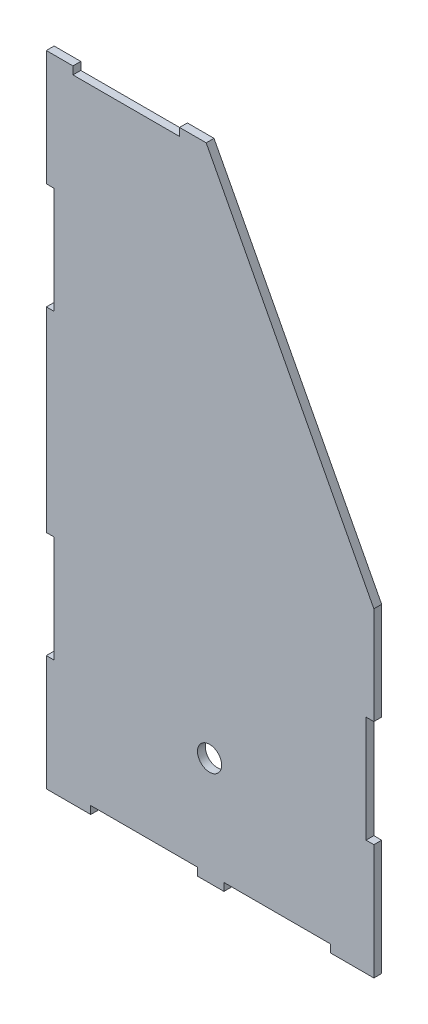
ISO-10303-21;
HEADER;
FILE_DESCRIPTION(('STEP AP214'),'2;1');
FILE_NAME('part.step','',(''),(''),'','','');
FILE_SCHEMA(('AUTOMOTIVE_DESIGN { 1 0 10303 214 1 1 1 1 }'));
ENDSEC;
DATA;
#1=APPLICATION_CONTEXT('core data for automotive mechanical design processes');
#2=APPLICATION_PROTOCOL_DEFINITION('international standard','automotive_design',2000,#1);
#3=PRODUCT_CONTEXT('',#1,'mechanical');
#4=PRODUCT('Part','Part','',(#3));
#5=PRODUCT_RELATED_PRODUCT_CATEGORY('part','',(#4));
#6=PRODUCT_DEFINITION_FORMATION('','',#4);
#7=PRODUCT_DEFINITION_CONTEXT('part definition',#1,'design');
#8=PRODUCT_DEFINITION('design','',#6,#7);
#9=PRODUCT_DEFINITION_SHAPE('','',#8);
#10=(LENGTH_UNIT() NAMED_UNIT(*) SI_UNIT(.MILLI.,.METRE.));
#11=(NAMED_UNIT(*) PLANE_ANGLE_UNIT() SI_UNIT($,.RADIAN.));
#12=(NAMED_UNIT(*) SI_UNIT($,.STERADIAN.) SOLID_ANGLE_UNIT());
#13=UNCERTAINTY_MEASURE_WITH_UNIT(LENGTH_MEASURE(1.E-05),#10,'distance_accuracy_value','');
#14=(GEOMETRIC_REPRESENTATION_CONTEXT(3) GLOBAL_UNCERTAINTY_ASSIGNED_CONTEXT((#13)) GLOBAL_UNIT_ASSIGNED_CONTEXT((#10,
#11,#12)) REPRESENTATION_CONTEXT('',''));
#15=CARTESIAN_POINT('',(0.,0.,0.));
#16=DIRECTION('',(0.,0.,1.));
#17=DIRECTION('',(1.,0.,0.));
#18=AXIS2_PLACEMENT_3D('',#15,#16,#17);
#19=CARTESIAN_POINT('',(321.219883672572,642.86985555023,5.588));
#20=DIRECTION('',(1.,0.,0.));
#21=DIRECTION('',(0.,0.,-1.));
#22=AXIS2_PLACEMENT_3D('',#19,#20,#21);
#23=PLANE('',#22);
#24=DIRECTION('',(0.,-1.,0.));
#25=VECTOR('',#24,1.);
#26=CARTESIAN_POINT('',(321.219883672572,642.86985555023,0.));
#27=LINE('',#26,#25);
#28=CARTESIAN_POINT('',(321.219883672572,484.11985555023,0.));
#29=VERTEX_POINT('',#28);
#30=CARTESIAN_POINT('',(321.219883672572,344.41985555023,0.));
#31=VERTEX_POINT('',#30);
#32=EDGE_CURVE('E248',#29,#31,#27,.T.);
#33=ORIENTED_EDGE('',*,*,#32,.T.);
#34=DIRECTION('',(0.,0.,1.));
#35=VECTOR('',#34,1.);
#36=CARTESIAN_POINT('',(321.219883672572,344.41985555023,0.));
#37=LINE('',#36,#35);
#38=CARTESIAN_POINT('',(321.219883672572,344.41985555023,5.588));
#39=VERTEX_POINT('',#38);
#40=EDGE_CURVE('E377',#31,#39,#37,.T.);
#41=ORIENTED_EDGE('',*,*,#40,.T.);
#42=DIRECTION('',(0.,-1.,0.));
#43=VECTOR('',#42,1.);
#44=CARTESIAN_POINT('',(321.219883672572,642.86985555023,5.588));
#45=LINE('',#44,#43);
#46=CARTESIAN_POINT('',(321.219883672572,484.11985555023,5.588));
#47=VERTEX_POINT('',#46);
#48=EDGE_CURVE('E413',#47,#39,#45,.T.);
#49=ORIENTED_EDGE('',*,*,#48,.F.);
#50=DIRECTION('',(0.,0.,1.));
#51=VECTOR('',#50,1.);
#52=CARTESIAN_POINT('',(321.219883672572,484.11985555023,0.));
#53=LINE('',#52,#51);
#54=EDGE_CURVE('E372',#29,#47,#53,.T.);
#55=ORIENTED_EDGE('',*,*,#54,.F.);
#56=EDGE_LOOP('',(#33,#41,#49,#55));
#57=FACE_BOUND('',#56,.T.);
#58=ADVANCED_FACE('F33',(#57),#23,.F.);
#59=CARTESIAN_POINT('',(321.219883672572,642.86985555023,0.));
#60=VERTEX_POINT('',#59);
#61=CARTESIAN_POINT('',(321.219883672572,560.31985555023,0.));
#62=VERTEX_POINT('',#61);
#63=EDGE_CURVE('E251',#60,#62,#27,.T.);
#64=ORIENTED_EDGE('',*,*,#63,.T.);
#65=DIRECTION('',(0.,0.,1.));
#66=VECTOR('',#65,1.);
#67=CARTESIAN_POINT('',(321.219883672572,560.31985555023,0.));
#68=LINE('',#67,#66);
#69=CARTESIAN_POINT('',(321.219883672572,560.31985555023,5.588));
#70=VERTEX_POINT('',#69);
#71=EDGE_CURVE('E348',#62,#70,#68,.T.);
#72=ORIENTED_EDGE('',*,*,#71,.T.);
#73=CARTESIAN_POINT('',(321.219883672572,642.86985555023,5.588));
#74=VERTEX_POINT('',#73);
#75=EDGE_CURVE('E409',#74,#70,#45,.T.);
#76=ORIENTED_EDGE('',*,*,#75,.F.);
#77=DIRECTION('',(0.,0.,-1.));
#78=VECTOR('',#77,1.);
#79=CARTESIAN_POINT('',(321.219883672572,642.86985555023,5.588));
#80=LINE('',#79,#78);
#81=EDGE_CURVE('E287',#74,#60,#80,.T.);
#82=ORIENTED_EDGE('',*,*,#81,.T.);
#83=EDGE_LOOP('',(#64,#72,#76,#82));
#84=FACE_BOUND('',#83,.T.);
#85=ADVANCED_FACE('F438',(#84),#23,.F.);
#86=CARTESIAN_POINT('',(321.219883672572,185.66985555023,5.588));
#87=DIRECTION('',(0.,1.,0.));
#88=DIRECTION('',(-1.,0.,0.));
#89=AXIS2_PLACEMENT_3D('',#86,#87,#88);
#90=PLANE('',#89);
#91=DIRECTION('',(1.,0.,0.));
#92=VECTOR('',#91,1.);
#93=CARTESIAN_POINT('',(321.219883672572,185.66985555023,0.));
#94=LINE('',#93,#92);
#95=CARTESIAN_POINT('',(321.219883672572,185.66985555023,0.));
#96=VERTEX_POINT('',#95);
#97=CARTESIAN_POINT('',(352.969883672572,185.66985555023,0.));
#98=VERTEX_POINT('',#97);
#99=EDGE_CURVE('E247',#96,#98,#94,.T.);
#100=ORIENTED_EDGE('',*,*,#99,.T.);
#101=DIRECTION('',(0.,0.,1.));
#102=VECTOR('',#101,1.);
#103=CARTESIAN_POINT('',(352.969883672572,185.66985555023,0.));
#104=LINE('',#103,#102);
#105=CARTESIAN_POINT('',(352.969883672572,185.66985555023,5.588));
#106=VERTEX_POINT('',#105);
#107=EDGE_CURVE('E461',#98,#106,#104,.T.);
#108=ORIENTED_EDGE('',*,*,#107,.T.);
#109=DIRECTION('',(1.,0.,0.));
#110=VECTOR('',#109,1.);
#111=CARTESIAN_POINT('',(321.219883672572,185.66985555023,5.588));
#112=LINE('',#111,#110);
#113=CARTESIAN_POINT('',(321.219883672572,185.66985555023,5.588));
#114=VERTEX_POINT('',#113);
#115=EDGE_CURVE('E414',#114,#106,#112,.T.);
#116=ORIENTED_EDGE('',*,*,#115,.F.);
#117=DIRECTION('',(0.,0.,-1.));
#118=VECTOR('',#117,1.);
#119=CARTESIAN_POINT('',(321.219883672572,185.66985555023,5.588));
#120=LINE('',#119,#118);
#121=EDGE_CURVE('E11',#114,#96,#120,.T.);
#122=ORIENTED_EDGE('',*,*,#121,.T.);
#123=EDGE_LOOP('',(#100,#108,#116,#122));
#124=FACE_BOUND('',#123,.T.);
#125=ADVANCED_FACE('F460',(#124),#90,.F.);
#126=CARTESIAN_POINT('',(429.169883672572,185.66985555023,5.588));
#127=VERTEX_POINT('',#126);
#128=CARTESIAN_POINT('',(448.219883672572,185.66985555023,5.588));
#129=VERTEX_POINT('',#128);
#130=EDGE_CURVE('E418',#127,#129,#112,.T.);
#131=ORIENTED_EDGE('',*,*,#130,.F.);
#132=DIRECTION('',(0.,0.,1.));
#133=VECTOR('',#132,1.);
#134=CARTESIAN_POINT('',(429.169883672572,185.66985555023,0.));
#135=LINE('',#134,#133);
#136=CARTESIAN_POINT('',(429.169883672572,185.66985555023,0.));
#137=VERTEX_POINT('',#136);
#138=EDGE_CURVE('E464',#137,#127,#135,.T.);
#139=ORIENTED_EDGE('',*,*,#138,.F.);
#140=CARTESIAN_POINT('',(448.219883672572,185.66985555023,0.));
#141=VERTEX_POINT('',#140);
#142=EDGE_CURVE('E263',#137,#141,#94,.T.);
#143=ORIENTED_EDGE('',*,*,#142,.T.);
#144=DIRECTION('',(0.,0.,1.));
#145=VECTOR('',#144,1.);
#146=CARTESIAN_POINT('',(448.219883672572,185.66985555023,0.));
#147=LINE('',#146,#145);
#148=EDGE_CURVE('E344',#141,#129,#147,.T.);
#149=ORIENTED_EDGE('',*,*,#148,.T.);
#150=EDGE_LOOP('',(#131,#139,#143,#149));
#151=FACE_BOUND('',#150,.T.);
#152=ADVANCED_FACE('F525',(#151),#90,.F.);
#153=CARTESIAN_POINT('',(555.407883672572,414.26985555023,5.588));
#154=DIRECTION('',(-1.,0.,0.));
#155=DIRECTION('',(0.,-1.,0.));
#156=AXIS2_PLACEMENT_3D('',#153,#154,#155);
#157=PLANE('',#156);
#158=DIRECTION('',(0.,1.,0.));
#159=VECTOR('',#158,1.);
#160=CARTESIAN_POINT('',(555.407883672572,414.26985555023,5.588));
#161=LINE('',#160,#159);
#162=CARTESIAN_POINT('',(555.407883672572,344.41985555023,5.588));
#163=VERTEX_POINT('',#162);
#164=CARTESIAN_POINT('',(555.407883672572,414.26985555023,5.588));
#165=VERTEX_POINT('',#164);
#166=EDGE_CURVE('E417',#163,#165,#161,.T.);
#167=ORIENTED_EDGE('',*,*,#166,.F.);
#168=DIRECTION('',(0.,0.,1.));
#169=VECTOR('',#168,1.);
#170=CARTESIAN_POINT('',(555.407883672572,344.41985555023,0.));
#171=LINE('',#170,#169);
#172=CARTESIAN_POINT('',(555.407883672572,344.41985555023,0.));
#173=VERTEX_POINT('',#172);
#174=EDGE_CURVE('E330',#173,#163,#171,.T.);
#175=ORIENTED_EDGE('',*,*,#174,.F.);
#176=DIRECTION('',(0.,1.,0.));
#177=VECTOR('',#176,1.);
#178=CARTESIAN_POINT('',(555.407883672572,414.26985555023,0.));
#179=LINE('',#178,#177);
#180=CARTESIAN_POINT('',(555.407883672572,414.26985555023,0.));
#181=VERTEX_POINT('',#180);
#182=EDGE_CURVE('E271',#173,#181,#179,.T.);
#183=ORIENTED_EDGE('',*,*,#182,.T.);
#184=DIRECTION('',(0.,0.,-1.));
#185=VECTOR('',#184,1.);
#186=CARTESIAN_POINT('',(555.407883672572,414.26985555023,5.588));
#187=LINE('',#186,#185);
#188=EDGE_CURVE('E293',#165,#181,#187,.T.);
#189=ORIENTED_EDGE('',*,*,#188,.F.);
#190=EDGE_LOOP('',(#167,#175,#183,#189));
#191=FACE_BOUND('',#190,.T.);
#192=ADVANCED_FACE('F526',(#191),#157,.F.);
#193=CARTESIAN_POINT('',(321.219883672572,642.86985555023,5.588));
#194=DIRECTION('',(0.,-1.,0.));
#195=DIRECTION('',(0.,0.,-1.));
#196=AXIS2_PLACEMENT_3D('',#193,#194,#195);
#197=PLANE('',#196);
#198=DIRECTION('',(-1.,0.,0.));
#199=VECTOR('',#198,1.);
#200=CARTESIAN_POINT('',(321.219883672572,642.86985555023,0.));
#201=LINE('',#200,#199);
#202=CARTESIAN_POINT('',(435.519883672572,642.86985555023,0.));
#203=VERTEX_POINT('',#202);
#204=CARTESIAN_POINT('',(416.469883672572,642.86985555023,0.));
#205=VERTEX_POINT('',#204);
#206=EDGE_CURVE('E284',#203,#205,#201,.T.);
#207=ORIENTED_EDGE('',*,*,#206,.T.);
#208=DIRECTION('',(0.,0.,1.));
#209=VECTOR('',#208,1.);
#210=CARTESIAN_POINT('',(416.469883672572,642.86985555023,0.));
#211=LINE('',#210,#209);
#212=CARTESIAN_POINT('',(416.469883672572,642.86985555023,5.588));
#213=VERTEX_POINT('',#212);
#214=EDGE_CURVE('E397',#205,#213,#211,.T.);
#215=ORIENTED_EDGE('',*,*,#214,.T.);
#216=DIRECTION('',(-1.,0.,0.));
#217=VECTOR('',#216,1.);
#218=CARTESIAN_POINT('',(321.219883672572,642.86985555023,5.588));
#219=LINE('',#218,#217);
#220=CARTESIAN_POINT('',(435.519883672572,642.86985555023,5.588));
#221=VERTEX_POINT('',#220);
#222=EDGE_CURVE('E290',#221,#213,#219,.T.);
#223=ORIENTED_EDGE('',*,*,#222,.F.);
#224=DIRECTION('',(0.,0.,-1.));
#225=VECTOR('',#224,1.);
#226=CARTESIAN_POINT('',(435.519883672572,642.86985555023,5.588));
#227=LINE('',#226,#225);
#228=EDGE_CURVE('E289',#221,#203,#227,.T.);
#229=ORIENTED_EDGE('',*,*,#228,.T.);
#230=EDGE_LOOP('',(#207,#215,#223,#229));
#231=FACE_BOUND('',#230,.T.);
#232=ADVANCED_FACE('F520',(#231),#197,.F.);
#233=CARTESIAN_POINT('',(321.219883672572,268.21985555023,5.588));
#234=VERTEX_POINT('',#233);
#235=EDGE_CURVE('E240',#234,#114,#45,.T.);
#236=ORIENTED_EDGE('',*,*,#235,.F.);
#237=DIRECTION('',(0.,0.,1.));
#238=VECTOR('',#237,1.);
#239=CARTESIAN_POINT('',(321.219883672572,268.21985555023,0.));
#240=LINE('',#239,#238);
#241=CARTESIAN_POINT('',(321.219883672572,268.21985555023,0.));
#242=VERTEX_POINT('',#241);
#243=EDGE_CURVE('E228',#242,#234,#240,.T.);
#244=ORIENTED_EDGE('',*,*,#243,.F.);
#245=EDGE_CURVE('E238',#242,#96,#27,.T.);
#246=ORIENTED_EDGE('',*,*,#245,.T.);
#247=ORIENTED_EDGE('',*,*,#121,.F.);
#248=EDGE_LOOP('',(#236,#244,#246,#247));
#249=FACE_BOUND('',#248,.T.);
#250=ADVANCED_FACE('F35',(#249),#23,.F.);
#251=CARTESIAN_POINT('',(524.419883672572,185.66985555023,5.588));
#252=VERTEX_POINT('',#251);
#253=CARTESIAN_POINT('',(555.407883672572,185.66985555023,5.588));
#254=VERTEX_POINT('',#253);
#255=EDGE_CURVE('E412',#252,#254,#112,.T.);
#256=ORIENTED_EDGE('',*,*,#255,.F.);
#257=DIRECTION('',(0.,0.,1.));
#258=VECTOR('',#257,1.);
#259=CARTESIAN_POINT('',(524.419883672572,185.66985555023,0.));
#260=LINE('',#259,#258);
#261=CARTESIAN_POINT('',(524.419883672572,185.66985555023,0.));
#262=VERTEX_POINT('',#261);
#263=EDGE_CURVE('E358',#262,#252,#260,.T.);
#264=ORIENTED_EDGE('',*,*,#263,.F.);
#265=CARTESIAN_POINT('',(555.407883672572,185.66985555023,0.));
#266=VERTEX_POINT('',#265);
#267=EDGE_CURVE('E258',#262,#266,#94,.T.);
#268=ORIENTED_EDGE('',*,*,#267,.T.);
#269=DIRECTION('',(0.,0.,-1.));
#270=VECTOR('',#269,1.);
#271=CARTESIAN_POINT('',(555.407883672572,185.66985555023,5.588));
#272=LINE('',#271,#270);
#273=EDGE_CURVE('E42',#254,#266,#272,.T.);
#274=ORIENTED_EDGE('',*,*,#273,.F.);
#275=EDGE_LOOP('',(#256,#264,#268,#274));
#276=FACE_BOUND('',#275,.T.);
#277=ADVANCED_FACE('F519',(#276),#90,.F.);
#278=CARTESIAN_POINT('',(555.407883672572,268.21985555023,0.));
#279=VERTEX_POINT('',#278);
#280=EDGE_CURVE('E274',#266,#279,#179,.T.);
#281=ORIENTED_EDGE('',*,*,#280,.T.);
#282=DIRECTION('',(0.,0.,1.));
#283=VECTOR('',#282,1.);
#284=CARTESIAN_POINT('',(555.407883672572,268.21985555023,0.));
#285=LINE('',#284,#283);
#286=CARTESIAN_POINT('',(555.407883672572,268.21985555023,5.588));
#287=VERTEX_POINT('',#286);
#288=EDGE_CURVE('E332',#279,#287,#285,.T.);
#289=ORIENTED_EDGE('',*,*,#288,.T.);
#290=EDGE_CURVE('E301',#254,#287,#161,.T.);
#291=ORIENTED_EDGE('',*,*,#290,.F.);
#292=ORIENTED_EDGE('',*,*,#273,.T.);
#293=EDGE_LOOP('',(#281,#289,#291,#292));
#294=FACE_BOUND('',#293,.T.);
#295=ADVANCED_FACE('F298',(#294),#157,.F.);
#296=CARTESIAN_POINT('',(435.519883672572,642.86985555023,5.588));
#297=DIRECTION('',(-0.88560030787723,-0.464448161464502,0.));
#298=DIRECTION('',(0.464448161464502,-0.88560030787723,0.));
#299=AXIS2_PLACEMENT_3D('',#296,#297,#298);
#300=PLANE('',#299);
#301=DIRECTION('',(-0.464448161464502,0.88560030787723,0.));
#302=VECTOR('',#301,1.);
#303=CARTESIAN_POINT('',(435.519883672572,642.86985555023,0.));
#304=LINE('',#303,#302);
#305=EDGE_CURVE('E280',#181,#203,#304,.T.);
#306=ORIENTED_EDGE('',*,*,#305,.T.);
#307=ORIENTED_EDGE('',*,*,#228,.F.);
#308=DIRECTION('',(-0.464448161464502,0.88560030787723,0.));
#309=VECTOR('',#308,1.);
#310=CARTESIAN_POINT('',(435.519883672572,642.86985555023,5.588));
#311=LINE('',#310,#309);
#312=EDGE_CURVE('E420',#165,#221,#311,.T.);
#313=ORIENTED_EDGE('',*,*,#312,.F.);
#314=ORIENTED_EDGE('',*,*,#188,.T.);
#315=EDGE_LOOP('',(#306,#307,#313,#314));
#316=FACE_BOUND('',#315,.T.);
#317=ADVANCED_FACE('F536',(#316),#300,.F.);
#318=CARTESIAN_POINT('',(340.269883672572,642.86985555023,5.588));
#319=VERTEX_POINT('',#318);
#320=EDGE_CURVE('E421',#319,#74,#219,.T.);
#321=ORIENTED_EDGE('',*,*,#320,.F.);
#322=DIRECTION('',(0.,0.,1.));
#323=VECTOR('',#322,1.);
#324=CARTESIAN_POINT('',(340.269883672572,642.86985555023,0.));
#325=LINE('',#324,#323);
#326=CARTESIAN_POINT('',(340.269883672572,642.86985555023,0.));
#327=VERTEX_POINT('',#326);
#328=EDGE_CURVE('E405',#327,#319,#325,.T.);
#329=ORIENTED_EDGE('',*,*,#328,.F.);
#330=EDGE_CURVE('E283',#327,#60,#201,.T.);
#331=ORIENTED_EDGE('',*,*,#330,.T.);
#332=ORIENTED_EDGE('',*,*,#81,.F.);
#333=EDGE_LOOP('',(#321,#329,#331,#332));
#334=FACE_BOUND('',#333,.T.);
#335=ADVANCED_FACE('F436',(#334),#197,.F.);
#336=CARTESIAN_POINT('',(0.,0.,5.588));
#337=DIRECTION('',(0.,0.,1.));
#338=DIRECTION('',(1.,0.,0.));
#339=AXIS2_PLACEMENT_3D('',#336,#337,#338);
#340=PLANE('',#339);
#341=CARTESIAN_POINT('',(437.932883672572,262.989065336249,5.588));
#342=DIRECTION('',(0.,0.,1.));
#343=DIRECTION('',(1.,0.,0.));
#344=AXIS2_PLACEMENT_3D('',#341,#342,#343);
#345=CIRCLE('',#344,8.63599999999998);
#346=CARTESIAN_POINT('',(446.568883672572,262.989065336249,5.588));
#347=VERTEX_POINT('',#346);
#348=EDGE_CURVE('E496',#347,#347,#345,.T.);
#349=ORIENTED_EDGE('',*,*,#348,.F.);
#350=EDGE_LOOP('',(#349));
#351=FACE_BOUND('',#350,.T.);
#352=DIRECTION('',(-1.,0.,0.));
#353=VECTOR('',#352,1.);
#354=CARTESIAN_POINT('',(549.819883672572,344.41985555023,5.588));
#355=LINE('',#354,#353);
#356=CARTESIAN_POINT('',(549.819883672572,344.41985555023,5.588));
#357=VERTEX_POINT('',#356);
#358=EDGE_CURVE('E316',#163,#357,#355,.T.);
#359=ORIENTED_EDGE('',*,*,#358,.F.);
#360=ORIENTED_EDGE('',*,*,#166,.T.);
#361=ORIENTED_EDGE('',*,*,#312,.T.);
#362=ORIENTED_EDGE('',*,*,#222,.T.);
#363=DIRECTION('',(0.,1.,0.));
#364=VECTOR('',#363,1.);
#365=CARTESIAN_POINT('',(416.469883672572,642.86985555023,5.588));
#366=LINE('',#365,#364);
#367=CARTESIAN_POINT('',(416.469883672572,637.28185555023,5.588));
#368=VERTEX_POINT('',#367);
#369=EDGE_CURVE('E355',#368,#213,#366,.T.);
#370=ORIENTED_EDGE('',*,*,#369,.F.);
#371=DIRECTION('',(1.,0.,0.));
#372=VECTOR('',#371,1.);
#373=CARTESIAN_POINT('',(416.469883672572,637.28185555023,5.588));
#374=LINE('',#373,#372);
#375=CARTESIAN_POINT('',(340.269883672572,637.28185555023,5.588));
#376=VERTEX_POINT('',#375);
#377=EDGE_CURVE('E391',#376,#368,#374,.T.);
#378=ORIENTED_EDGE('',*,*,#377,.F.);
#379=DIRECTION('',(0.,-1.,0.));
#380=VECTOR('',#379,1.);
#381=CARTESIAN_POINT('',(340.269883672572,642.86985555023,5.588));
#382=LINE('',#381,#380);
#383=EDGE_CURVE('E399',#319,#376,#382,.T.);
#384=ORIENTED_EDGE('',*,*,#383,.F.);
#385=ORIENTED_EDGE('',*,*,#320,.T.);
#386=ORIENTED_EDGE('',*,*,#75,.T.);
#387=DIRECTION('',(-1.,0.,0.));
#388=VECTOR('',#387,1.);
#389=CARTESIAN_POINT('',(321.219883672572,560.31985555023,5.588));
#390=LINE('',#389,#388);
#391=CARTESIAN_POINT('',(326.807883672572,560.31985555023,5.588));
#392=VERTEX_POINT('',#391);
#393=EDGE_CURVE('E366',#392,#70,#390,.T.);
#394=ORIENTED_EDGE('',*,*,#393,.F.);
#395=DIRECTION('',(0.,1.,0.));
#396=VECTOR('',#395,1.);
#397=CARTESIAN_POINT('',(326.807883672572,560.31985555023,5.588));
#398=LINE('',#397,#396);
#399=CARTESIAN_POINT('',(326.807883672572,484.11985555023,5.588));
#400=VERTEX_POINT('',#399);
#401=EDGE_CURVE('E376',#400,#392,#398,.T.);
#402=ORIENTED_EDGE('',*,*,#401,.F.);
#403=DIRECTION('',(1.,0.,0.));
#404=VECTOR('',#403,1.);
#405=CARTESIAN_POINT('',(321.219883672572,484.11985555023,5.588));
#406=LINE('',#405,#404);
#407=EDGE_CURVE('E373',#47,#400,#406,.T.);
#408=ORIENTED_EDGE('',*,*,#407,.F.);
#409=ORIENTED_EDGE('',*,*,#48,.T.);
#410=DIRECTION('',(-1.,0.,0.));
#411=VECTOR('',#410,1.);
#412=CARTESIAN_POINT('',(321.219883672572,344.41985555023,5.588));
#413=LINE('',#412,#411);
#414=CARTESIAN_POINT('',(326.807883672572,344.41985555023,5.588));
#415=VERTEX_POINT('',#414);
#416=EDGE_CURVE('E233',#415,#39,#413,.T.);
#417=ORIENTED_EDGE('',*,*,#416,.F.);
#418=DIRECTION('',(0.,1.,0.));
#419=VECTOR('',#418,1.);
#420=CARTESIAN_POINT('',(326.807883672572,344.41985555023,5.588));
#421=LINE('',#420,#419);
#422=CARTESIAN_POINT('',(326.807883672572,268.21985555023,5.588));
#423=VERTEX_POINT('',#422);
#424=EDGE_CURVE('E489',#423,#415,#421,.T.);
#425=ORIENTED_EDGE('',*,*,#424,.F.);
#426=DIRECTION('',(1.,0.,0.));
#427=VECTOR('',#426,1.);
#428=CARTESIAN_POINT('',(321.219883672572,268.21985555023,5.588));
#429=LINE('',#428,#427);
#430=EDGE_CURVE('E459',#234,#423,#429,.T.);
#431=ORIENTED_EDGE('',*,*,#430,.F.);
#432=ORIENTED_EDGE('',*,*,#235,.T.);
#433=ORIENTED_EDGE('',*,*,#115,.T.);
#434=DIRECTION('',(0.,-1.,0.));
#435=VECTOR('',#434,1.);
#436=CARTESIAN_POINT('',(352.969883672572,191.25785555023,5.588));
#437=LINE('',#436,#435);
#438=CARTESIAN_POINT('',(352.969883672572,191.25785555023,5.588));
#439=VERTEX_POINT('',#438);
#440=EDGE_CURVE('E329',#439,#106,#437,.T.);
#441=ORIENTED_EDGE('',*,*,#440,.F.);
#442=DIRECTION('',(-1.,0.,0.));
#443=VECTOR('',#442,1.);
#444=CARTESIAN_POINT('',(352.969883672572,191.25785555023,5.588));
#445=LINE('',#444,#443);
#446=CARTESIAN_POINT('',(429.169883672572,191.25785555023,5.588));
#447=VERTEX_POINT('',#446);
#448=EDGE_CURVE('E473',#447,#439,#445,.T.);
#449=ORIENTED_EDGE('',*,*,#448,.F.);
#450=DIRECTION('',(0.,1.,0.));
#451=VECTOR('',#450,1.);
#452=CARTESIAN_POINT('',(429.169883672572,191.25785555023,5.588));
#453=LINE('',#452,#451);
#454=EDGE_CURVE('E477',#127,#447,#453,.T.);
#455=ORIENTED_EDGE('',*,*,#454,.F.);
#456=ORIENTED_EDGE('',*,*,#130,.T.);
#457=DIRECTION('',(0.,-1.,0.));
#458=VECTOR('',#457,1.);
#459=CARTESIAN_POINT('',(448.219883672572,191.25785555023,5.588));
#460=LINE('',#459,#458);
#461=CARTESIAN_POINT('',(448.219883672572,191.25785555023,5.588));
#462=VERTEX_POINT('',#461);
#463=EDGE_CURVE('E345',#462,#129,#460,.T.);
#464=ORIENTED_EDGE('',*,*,#463,.F.);
#465=DIRECTION('',(-1.,0.,0.));
#466=VECTOR('',#465,1.);
#467=CARTESIAN_POINT('',(448.219883672572,191.25785555023,5.588));
#468=LINE('',#467,#466);
#469=CARTESIAN_POINT('',(524.419883672572,191.25785555023,5.588));
#470=VERTEX_POINT('',#469);
#471=EDGE_CURVE('E339',#470,#462,#468,.T.);
#472=ORIENTED_EDGE('',*,*,#471,.F.);
#473=DIRECTION('',(0.,1.,0.));
#474=VECTOR('',#473,1.);
#475=CARTESIAN_POINT('',(524.419883672572,191.25785555023,5.588));
#476=LINE('',#475,#474);
#477=EDGE_CURVE('E347',#252,#470,#476,.T.);
#478=ORIENTED_EDGE('',*,*,#477,.F.);
#479=ORIENTED_EDGE('',*,*,#255,.T.);
#480=ORIENTED_EDGE('',*,*,#290,.T.);
#481=DIRECTION('',(1.,0.,0.));
#482=VECTOR('',#481,1.);
#483=CARTESIAN_POINT('',(549.819883672572,268.21985555023,5.588));
#484=LINE('',#483,#482);
#485=CARTESIAN_POINT('',(549.819883672572,268.21985555023,5.588));
#486=VERTEX_POINT('',#485);
#487=EDGE_CURVE('E323',#486,#287,#484,.T.);
#488=ORIENTED_EDGE('',*,*,#487,.F.);
#489=DIRECTION('',(0.,-1.,0.));
#490=VECTOR('',#489,1.);
#491=CARTESIAN_POINT('',(549.819883672572,344.41985555023,5.588));
#492=LINE('',#491,#490);
#493=EDGE_CURVE('E320',#357,#486,#492,.T.);
#494=ORIENTED_EDGE('',*,*,#493,.F.);
#495=EDGE_LOOP('',(#359,#360,#361,#362,#370,#378,#384,#385,#386,#394,#402,#408,#409,#417,#425,
#431,#432,#433,#441,#449,#455,#456,#464,#472,#478,#479,#480,#488,#494));
#496=FACE_BOUND('',#495,.T.);
#497=ADVANCED_FACE('F430',(#351,#496),#340,.T.);
#498=CARTESIAN_POINT('',(0.,0.,0.));
#499=DIRECTION('',(0.,0.,1.));
#500=DIRECTION('',(1.,0.,0.));
#501=AXIS2_PLACEMENT_3D('',#498,#499,#500);
#502=PLANE('',#501);
#503=CARTESIAN_POINT('',(437.932883672572,262.989065336249,0.));
#504=DIRECTION('',(0.,0.,1.));
#505=DIRECTION('',(1.,0.,0.));
#506=AXIS2_PLACEMENT_3D('',#503,#504,#505);
#507=CIRCLE('',#506,8.63599999999998);
#508=CARTESIAN_POINT('',(446.568883672572,262.989065336249,0.));
#509=VERTEX_POINT('',#508);
#510=EDGE_CURVE('E37',#509,#509,#507,.T.);
#511=ORIENTED_EDGE('',*,*,#510,.T.);
#512=EDGE_LOOP('',(#511));
#513=FACE_BOUND('',#512,.T.);
#514=ORIENTED_EDGE('',*,*,#182,.F.);
#515=DIRECTION('',(-1.,0.,0.));
#516=VECTOR('',#515,1.);
#517=CARTESIAN_POINT('',(549.819883672572,344.41985555023,0.));
#518=LINE('',#517,#516);
#519=CARTESIAN_POINT('',(549.819883672572,344.41985555023,0.));
#520=VERTEX_POINT('',#519);
#521=EDGE_CURVE('E312',#173,#520,#518,.T.);
#522=ORIENTED_EDGE('',*,*,#521,.T.);
#523=DIRECTION('',(0.,-1.,0.));
#524=VECTOR('',#523,1.);
#525=CARTESIAN_POINT('',(549.819883672572,344.41985555023,0.));
#526=LINE('',#525,#524);
#527=CARTESIAN_POINT('',(549.819883672572,268.21985555023,0.));
#528=VERTEX_POINT('',#527);
#529=EDGE_CURVE('E310',#520,#528,#526,.T.);
#530=ORIENTED_EDGE('',*,*,#529,.T.);
#531=DIRECTION('',(1.,0.,0.));
#532=VECTOR('',#531,1.);
#533=CARTESIAN_POINT('',(549.819883672572,268.21985555023,0.));
#534=LINE('',#533,#532);
#535=EDGE_CURVE('E307',#528,#279,#534,.T.);
#536=ORIENTED_EDGE('',*,*,#535,.T.);
#537=ORIENTED_EDGE('',*,*,#280,.F.);
#538=ORIENTED_EDGE('',*,*,#267,.F.);
#539=DIRECTION('',(0.,1.,0.));
#540=VECTOR('',#539,1.);
#541=CARTESIAN_POINT('',(524.419883672572,191.25785555023,0.));
#542=LINE('',#541,#540);
#543=CARTESIAN_POINT('',(524.419883672572,191.25785555023,0.));
#544=VERTEX_POINT('',#543);
#545=EDGE_CURVE('E338',#262,#544,#542,.T.);
#546=ORIENTED_EDGE('',*,*,#545,.T.);
#547=DIRECTION('',(-1.,0.,0.));
#548=VECTOR('',#547,1.);
#549=CARTESIAN_POINT('',(448.219883672572,191.25785555023,0.));
#550=LINE('',#549,#548);
#551=CARTESIAN_POINT('',(448.219883672572,191.25785555023,0.));
#552=VERTEX_POINT('',#551);
#553=EDGE_CURVE('E341',#544,#552,#550,.T.);
#554=ORIENTED_EDGE('',*,*,#553,.T.);
#555=DIRECTION('',(0.,-1.,0.));
#556=VECTOR('',#555,1.);
#557=CARTESIAN_POINT('',(448.219883672572,191.25785555023,0.));
#558=LINE('',#557,#556);
#559=EDGE_CURVE('E335',#552,#141,#558,.T.);
#560=ORIENTED_EDGE('',*,*,#559,.T.);
#561=ORIENTED_EDGE('',*,*,#142,.F.);
#562=DIRECTION('',(0.,1.,0.));
#563=VECTOR('',#562,1.);
#564=CARTESIAN_POINT('',(429.169883672572,191.25785555023,0.));
#565=LINE('',#564,#563);
#566=CARTESIAN_POINT('',(429.169883672572,191.25785555023,0.));
#567=VERTEX_POINT('',#566);
#568=EDGE_CURVE('E467',#137,#567,#565,.T.);
#569=ORIENTED_EDGE('',*,*,#568,.T.);
#570=DIRECTION('',(-1.,0.,0.));
#571=VECTOR('',#570,1.);
#572=CARTESIAN_POINT('',(352.969883672572,191.25785555023,0.));
#573=LINE('',#572,#571);
#574=CARTESIAN_POINT('',(352.969883672572,191.25785555023,0.));
#575=VERTEX_POINT('',#574);
#576=EDGE_CURVE('E49',#567,#575,#573,.T.);
#577=ORIENTED_EDGE('',*,*,#576,.T.);
#578=DIRECTION('',(0.,-1.,0.));
#579=VECTOR('',#578,1.);
#580=CARTESIAN_POINT('',(352.969883672572,191.25785555023,0.));
#581=LINE('',#580,#579);
#582=EDGE_CURVE('E476',#575,#98,#581,.T.);
#583=ORIENTED_EDGE('',*,*,#582,.T.);
#584=ORIENTED_EDGE('',*,*,#99,.F.);
#585=ORIENTED_EDGE('',*,*,#245,.F.);
#586=DIRECTION('',(1.,0.,0.));
#587=VECTOR('',#586,1.);
#588=CARTESIAN_POINT('',(321.219883672572,268.21985555023,0.));
#589=LINE('',#588,#587);
#590=CARTESIAN_POINT('',(326.807883672572,268.21985555023,0.));
#591=VERTEX_POINT('',#590);
#592=EDGE_CURVE('E224',#242,#591,#589,.T.);
#593=ORIENTED_EDGE('',*,*,#592,.T.);
#594=DIRECTION('',(0.,1.,0.));
#595=VECTOR('',#594,1.);
#596=CARTESIAN_POINT('',(326.807883672572,344.41985555023,0.));
#597=LINE('',#596,#595);
#598=CARTESIAN_POINT('',(326.807883672572,344.41985555023,0.));
#599=VERTEX_POINT('',#598);
#600=EDGE_CURVE('E57',#591,#599,#597,.T.);
#601=ORIENTED_EDGE('',*,*,#600,.T.);
#602=DIRECTION('',(-1.,0.,0.));
#603=VECTOR('',#602,1.);
#604=CARTESIAN_POINT('',(321.219883672572,344.41985555023,0.));
#605=LINE('',#604,#603);
#606=EDGE_CURVE('E241',#599,#31,#605,.T.);
#607=ORIENTED_EDGE('',*,*,#606,.T.);
#608=ORIENTED_EDGE('',*,*,#32,.F.);
#609=DIRECTION('',(1.,0.,0.));
#610=VECTOR('',#609,1.);
#611=CARTESIAN_POINT('',(321.219883672572,484.11985555023,0.));
#612=LINE('',#611,#610);
#613=CARTESIAN_POINT('',(326.807883672572,484.11985555023,0.));
#614=VERTEX_POINT('',#613);
#615=EDGE_CURVE('E362',#29,#614,#612,.T.);
#616=ORIENTED_EDGE('',*,*,#615,.T.);
#617=DIRECTION('',(0.,1.,0.));
#618=VECTOR('',#617,1.);
#619=CARTESIAN_POINT('',(326.807883672572,560.31985555023,0.));
#620=LINE('',#619,#618);
#621=CARTESIAN_POINT('',(326.807883672572,560.31985555023,0.));
#622=VERTEX_POINT('',#621);
#623=EDGE_CURVE('E365',#614,#622,#620,.T.);
#624=ORIENTED_EDGE('',*,*,#623,.T.);
#625=DIRECTION('',(-1.,0.,0.));
#626=VECTOR('',#625,1.);
#627=CARTESIAN_POINT('',(321.219883672572,560.31985555023,0.));
#628=LINE('',#627,#626);
#629=EDGE_CURVE('E369',#622,#62,#628,.T.);
#630=ORIENTED_EDGE('',*,*,#629,.T.);
#631=ORIENTED_EDGE('',*,*,#63,.F.);
#632=ORIENTED_EDGE('',*,*,#330,.F.);
#633=DIRECTION('',(0.,-1.,0.));
#634=VECTOR('',#633,1.);
#635=CARTESIAN_POINT('',(340.269883672572,642.86985555023,0.));
#636=LINE('',#635,#634);
#637=CARTESIAN_POINT('',(340.269883672572,637.28185555023,0.));
#638=VERTEX_POINT('',#637);
#639=EDGE_CURVE('E390',#327,#638,#636,.T.);
#640=ORIENTED_EDGE('',*,*,#639,.T.);
#641=DIRECTION('',(1.,0.,0.));
#642=VECTOR('',#641,1.);
#643=CARTESIAN_POINT('',(416.469883672572,637.28185555023,0.));
#644=LINE('',#643,#642);
#645=CARTESIAN_POINT('',(416.469883672572,637.28185555023,0.));
#646=VERTEX_POINT('',#645);
#647=EDGE_CURVE('E394',#638,#646,#644,.T.);
#648=ORIENTED_EDGE('',*,*,#647,.T.);
#649=DIRECTION('',(0.,1.,0.));
#650=VECTOR('',#649,1.);
#651=CARTESIAN_POINT('',(416.469883672572,642.86985555023,0.));
#652=LINE('',#651,#650);
#653=EDGE_CURVE('E387',#646,#205,#652,.T.);
#654=ORIENTED_EDGE('',*,*,#653,.T.);
#655=ORIENTED_EDGE('',*,*,#206,.F.);
#656=ORIENTED_EDGE('',*,*,#305,.F.);
#657=EDGE_LOOP('',(#514,#522,#530,#536,#537,#538,#546,#554,#560,#561,#569,#577,#583,#584,#585,
#593,#601,#607,#608,#616,#624,#630,#631,#632,#640,#648,#654,#655,#656));
#658=FACE_BOUND('',#657,.T.);
#659=ADVANCED_FACE('F244',(#513,#658),#502,.F.);
#660=CARTESIAN_POINT('',(416.469883672572,642.86985555023,0.));
#661=DIRECTION('',(1.,0.,0.));
#662=DIRECTION('',(0.,0.,-1.));
#663=AXIS2_PLACEMENT_3D('',#660,#661,#662);
#664=PLANE('',#663);
#665=ORIENTED_EDGE('',*,*,#369,.T.);
#666=ORIENTED_EDGE('',*,*,#214,.F.);
#667=ORIENTED_EDGE('',*,*,#653,.F.);
#668=DIRECTION('',(0.,0.,1.));
#669=VECTOR('',#668,1.);
#670=CARTESIAN_POINT('',(416.469883672572,637.28185555023,0.));
#671=LINE('',#670,#669);
#672=EDGE_CURVE('E249',#646,#368,#671,.T.);
#673=ORIENTED_EDGE('',*,*,#672,.T.);
#674=EDGE_LOOP('',(#665,#666,#667,#673));
#675=FACE_BOUND('',#674,.T.);
#676=ADVANCED_FACE('F553',(#675),#664,.F.);
#677=CARTESIAN_POINT('',(416.469883672572,637.28185555023,0.));
#678=DIRECTION('',(0.,-1.,0.));
#679=DIRECTION('',(0.,0.,-1.));
#680=AXIS2_PLACEMENT_3D('',#677,#678,#679);
#681=PLANE('',#680);
#682=ORIENTED_EDGE('',*,*,#377,.T.);
#683=ORIENTED_EDGE('',*,*,#672,.F.);
#684=ORIENTED_EDGE('',*,*,#647,.F.);
#685=DIRECTION('',(0.,0.,1.));
#686=VECTOR('',#685,1.);
#687=CARTESIAN_POINT('',(340.269883672572,637.28185555023,0.));
#688=LINE('',#687,#686);
#689=EDGE_CURVE('E253',#638,#376,#688,.T.);
#690=ORIENTED_EDGE('',*,*,#689,.T.);
#691=EDGE_LOOP('',(#682,#683,#684,#690));
#692=FACE_BOUND('',#691,.T.);
#693=ADVANCED_FACE('F555',(#692),#681,.F.);
#694=CARTESIAN_POINT('',(340.269883672572,642.86985555023,0.));
#695=DIRECTION('',(-1.,0.,0.));
#696=DIRECTION('',(0.,0.,1.));
#697=AXIS2_PLACEMENT_3D('',#694,#695,#696);
#698=PLANE('',#697);
#699=ORIENTED_EDGE('',*,*,#383,.T.);
#700=ORIENTED_EDGE('',*,*,#689,.F.);
#701=ORIENTED_EDGE('',*,*,#639,.F.);
#702=ORIENTED_EDGE('',*,*,#328,.T.);
#703=EDGE_LOOP('',(#699,#700,#701,#702));
#704=FACE_BOUND('',#703,.T.);
#705=ADVANCED_FACE('F558',(#704),#698,.F.);
#706=CARTESIAN_POINT('',(448.219883672572,191.25785555023,0.));
#707=DIRECTION('',(-1.,0.,0.));
#708=DIRECTION('',(0.,0.,1.));
#709=AXIS2_PLACEMENT_3D('',#706,#707,#708);
#710=PLANE('',#709);
#711=ORIENTED_EDGE('',*,*,#463,.T.);
#712=ORIENTED_EDGE('',*,*,#148,.F.);
#713=ORIENTED_EDGE('',*,*,#559,.F.);
#714=DIRECTION('',(0.,0.,1.));
#715=VECTOR('',#714,1.);
#716=CARTESIAN_POINT('',(448.219883672572,191.25785555023,0.));
#717=LINE('',#716,#715);
#718=EDGE_CURVE('E353',#552,#462,#717,.T.);
#719=ORIENTED_EDGE('',*,*,#718,.T.);
#720=EDGE_LOOP('',(#711,#712,#713,#719));
#721=FACE_BOUND('',#720,.T.);
#722=ADVANCED_FACE('F560',(#721),#710,.F.);
#723=CARTESIAN_POINT('',(448.219883672572,191.25785555023,0.));
#724=DIRECTION('',(0.,1.,0.));
#725=DIRECTION('',(0.,0.,1.));
#726=AXIS2_PLACEMENT_3D('',#723,#724,#725);
#727=PLANE('',#726);
#728=ORIENTED_EDGE('',*,*,#471,.T.);
#729=ORIENTED_EDGE('',*,*,#718,.F.);
#730=ORIENTED_EDGE('',*,*,#553,.F.);
#731=DIRECTION('',(0.,0.,1.));
#732=VECTOR('',#731,1.);
#733=CARTESIAN_POINT('',(524.419883672572,191.25785555023,0.));
#734=LINE('',#733,#732);
#735=EDGE_CURVE('E356',#544,#470,#734,.T.);
#736=ORIENTED_EDGE('',*,*,#735,.T.);
#737=EDGE_LOOP('',(#728,#729,#730,#736));
#738=FACE_BOUND('',#737,.T.);
#739=ADVANCED_FACE('F566',(#738),#727,.F.);
#740=CARTESIAN_POINT('',(524.419883672572,191.25785555023,0.));
#741=DIRECTION('',(1.,0.,0.));
#742=DIRECTION('',(0.,1.,0.));
#743=AXIS2_PLACEMENT_3D('',#740,#741,#742);
#744=PLANE('',#743);
#745=ORIENTED_EDGE('',*,*,#477,.T.);
#746=ORIENTED_EDGE('',*,*,#735,.F.);
#747=ORIENTED_EDGE('',*,*,#545,.F.);
#748=ORIENTED_EDGE('',*,*,#263,.T.);
#749=EDGE_LOOP('',(#745,#746,#747,#748));
#750=FACE_BOUND('',#749,.T.);
#751=ADVANCED_FACE('F605',(#750),#744,.F.);
#752=CARTESIAN_POINT('',(321.219883672572,560.31985555023,0.));
#753=DIRECTION('',(0.,1.,0.));
#754=DIRECTION('',(0.,0.,1.));
#755=AXIS2_PLACEMENT_3D('',#752,#753,#754);
#756=PLANE('',#755);
#757=ORIENTED_EDGE('',*,*,#393,.T.);
#758=ORIENTED_EDGE('',*,*,#71,.F.);
#759=ORIENTED_EDGE('',*,*,#629,.F.);
#760=DIRECTION('',(0.,0.,1.));
#761=VECTOR('',#760,1.);
#762=CARTESIAN_POINT('',(326.807883672572,560.31985555023,0.));
#763=LINE('',#762,#761);
#764=EDGE_CURVE('E382',#622,#392,#763,.T.);
#765=ORIENTED_EDGE('',*,*,#764,.T.);
#766=EDGE_LOOP('',(#757,#758,#759,#765));
#767=FACE_BOUND('',#766,.T.);
#768=ADVANCED_FACE('F441',(#767),#756,.F.);
#769=CARTESIAN_POINT('',(326.807883672572,560.31985555023,0.));
#770=DIRECTION('',(1.,0.,0.));
#771=DIRECTION('',(0.,0.,-1.));
#772=AXIS2_PLACEMENT_3D('',#769,#770,#771);
#773=PLANE('',#772);
#774=ORIENTED_EDGE('',*,*,#401,.T.);
#775=ORIENTED_EDGE('',*,*,#764,.F.);
#776=ORIENTED_EDGE('',*,*,#623,.F.);
#777=DIRECTION('',(0.,0.,1.));
#778=VECTOR('',#777,1.);
#779=CARTESIAN_POINT('',(326.807883672572,484.11985555023,0.));
#780=LINE('',#779,#778);
#781=EDGE_CURVE('E384',#614,#400,#780,.T.);
#782=ORIENTED_EDGE('',*,*,#781,.T.);
#783=EDGE_LOOP('',(#774,#775,#776,#782));
#784=FACE_BOUND('',#783,.T.);
#785=ADVANCED_FACE('F445',(#784),#773,.F.);
#786=CARTESIAN_POINT('',(321.219883672572,484.11985555023,0.));
#787=DIRECTION('',(0.,-1.,0.));
#788=DIRECTION('',(0.,0.,-1.));
#789=AXIS2_PLACEMENT_3D('',#786,#787,#788);
#790=PLANE('',#789);
#791=ORIENTED_EDGE('',*,*,#407,.T.);
#792=ORIENTED_EDGE('',*,*,#781,.F.);
#793=ORIENTED_EDGE('',*,*,#615,.F.);
#794=ORIENTED_EDGE('',*,*,#54,.T.);
#795=EDGE_LOOP('',(#791,#792,#793,#794));
#796=FACE_BOUND('',#795,.T.);
#797=ADVANCED_FACE('F447',(#796),#790,.F.);
#798=CARTESIAN_POINT('',(321.219883672572,344.41985555023,0.));
#799=DIRECTION('',(0.,1.,0.));
#800=DIRECTION('',(0.,0.,1.));
#801=AXIS2_PLACEMENT_3D('',#798,#799,#800);
#802=PLANE('',#801);
#803=ORIENTED_EDGE('',*,*,#416,.T.);
#804=ORIENTED_EDGE('',*,*,#40,.F.);
#805=ORIENTED_EDGE('',*,*,#606,.F.);
#806=DIRECTION('',(0.,0.,1.));
#807=VECTOR('',#806,1.);
#808=CARTESIAN_POINT('',(326.807883672572,344.41985555023,0.));
#809=LINE('',#808,#807);
#810=EDGE_CURVE('E485',#599,#415,#809,.T.);
#811=ORIENTED_EDGE('',*,*,#810,.T.);
#812=EDGE_LOOP('',(#803,#804,#805,#811));
#813=FACE_BOUND('',#812,.T.);
#814=ADVANCED_FACE('F640',(#813),#802,.F.);
#815=CARTESIAN_POINT('',(326.807883672572,344.41985555023,0.));
#816=DIRECTION('',(1.,0.,0.));
#817=DIRECTION('',(0.,0.,-1.));
#818=AXIS2_PLACEMENT_3D('',#815,#816,#817);
#819=PLANE('',#818);
#820=ORIENTED_EDGE('',*,*,#424,.T.);
#821=ORIENTED_EDGE('',*,*,#810,.F.);
#822=ORIENTED_EDGE('',*,*,#600,.F.);
#823=DIRECTION('',(0.,0.,1.));
#824=VECTOR('',#823,1.);
#825=CARTESIAN_POINT('',(326.807883672572,268.21985555023,0.));
#826=LINE('',#825,#824);
#827=EDGE_CURVE('E230',#591,#423,#826,.T.);
#828=ORIENTED_EDGE('',*,*,#827,.T.);
#829=EDGE_LOOP('',(#820,#821,#822,#828));
#830=FACE_BOUND('',#829,.T.);
#831=ADVANCED_FACE('F648',(#830),#819,.F.);
#832=CARTESIAN_POINT('',(321.219883672572,268.21985555023,0.));
#833=DIRECTION('',(0.,-1.,0.));
#834=DIRECTION('',(0.,0.,-1.));
#835=AXIS2_PLACEMENT_3D('',#832,#833,#834);
#836=PLANE('',#835);
#837=ORIENTED_EDGE('',*,*,#430,.T.);
#838=ORIENTED_EDGE('',*,*,#827,.F.);
#839=ORIENTED_EDGE('',*,*,#592,.F.);
#840=ORIENTED_EDGE('',*,*,#243,.T.);
#841=EDGE_LOOP('',(#837,#838,#839,#840));
#842=FACE_BOUND('',#841,.T.);
#843=ADVANCED_FACE('F227',(#842),#836,.F.);
#844=CARTESIAN_POINT('',(352.969883672572,191.25785555023,0.));
#845=DIRECTION('',(-1.,0.,0.));
#846=DIRECTION('',(0.,0.,1.));
#847=AXIS2_PLACEMENT_3D('',#844,#845,#846);
#848=PLANE('',#847);
#849=ORIENTED_EDGE('',*,*,#440,.T.);
#850=ORIENTED_EDGE('',*,*,#107,.F.);
#851=ORIENTED_EDGE('',*,*,#582,.F.);
#852=DIRECTION('',(0.,0.,1.));
#853=VECTOR('',#852,1.);
#854=CARTESIAN_POINT('',(352.969883672572,191.25785555023,0.));
#855=LINE('',#854,#853);
#856=EDGE_CURVE('E471',#575,#439,#855,.T.);
#857=ORIENTED_EDGE('',*,*,#856,.T.);
#858=EDGE_LOOP('',(#849,#850,#851,#857));
#859=FACE_BOUND('',#858,.T.);
#860=ADVANCED_FACE('F665',(#859),#848,.F.);
#861=CARTESIAN_POINT('',(352.969883672572,191.25785555023,0.));
#862=DIRECTION('',(0.,1.,0.));
#863=DIRECTION('',(0.,0.,1.));
#864=AXIS2_PLACEMENT_3D('',#861,#862,#863);
#865=PLANE('',#864);
#866=ORIENTED_EDGE('',*,*,#448,.T.);
#867=ORIENTED_EDGE('',*,*,#856,.F.);
#868=ORIENTED_EDGE('',*,*,#576,.F.);
#869=DIRECTION('',(0.,0.,1.));
#870=VECTOR('',#869,1.);
#871=CARTESIAN_POINT('',(429.169883672572,191.25785555023,0.));
#872=LINE('',#871,#870);
#873=EDGE_CURVE('E465',#567,#447,#872,.T.);
#874=ORIENTED_EDGE('',*,*,#873,.T.);
#875=EDGE_LOOP('',(#866,#867,#868,#874));
#876=FACE_BOUND('',#875,.T.);
#877=ADVANCED_FACE('F674',(#876),#865,.F.);
#878=CARTESIAN_POINT('',(429.169883672572,191.25785555023,0.));
#879=DIRECTION('',(1.,0.,0.));
#880=DIRECTION('',(0.,0.,-1.));
#881=AXIS2_PLACEMENT_3D('',#878,#879,#880);
#882=PLANE('',#881);
#883=ORIENTED_EDGE('',*,*,#454,.T.);
#884=ORIENTED_EDGE('',*,*,#873,.F.);
#885=ORIENTED_EDGE('',*,*,#568,.F.);
#886=ORIENTED_EDGE('',*,*,#138,.T.);
#887=EDGE_LOOP('',(#883,#884,#885,#886));
#888=FACE_BOUND('',#887,.T.);
#889=ADVANCED_FACE('F683',(#888),#882,.F.);
#890=CARTESIAN_POINT('',(549.819883672572,344.41985555023,0.));
#891=DIRECTION('',(-1.,0.,0.));
#892=DIRECTION('',(0.,-1.,0.));
#893=AXIS2_PLACEMENT_3D('',#890,#891,#892);
#894=PLANE('',#893);
#895=ORIENTED_EDGE('',*,*,#493,.T.);
#896=DIRECTION('',(0.,0.,1.));
#897=VECTOR('',#896,1.);
#898=CARTESIAN_POINT('',(549.819883672572,268.21985555023,0.));
#899=LINE('',#898,#897);
#900=EDGE_CURVE('E314',#528,#486,#899,.T.);
#901=ORIENTED_EDGE('',*,*,#900,.F.);
#902=ORIENTED_EDGE('',*,*,#529,.F.);
#903=DIRECTION('',(0.,0.,1.));
#904=VECTOR('',#903,1.);
#905=CARTESIAN_POINT('',(549.819883672572,344.41985555023,0.));
#906=LINE('',#905,#904);
#907=EDGE_CURVE('E327',#520,#357,#906,.T.);
#908=ORIENTED_EDGE('',*,*,#907,.T.);
#909=EDGE_LOOP('',(#895,#901,#902,#908));
#910=FACE_BOUND('',#909,.T.);
#911=ADVANCED_FACE('F692',(#910),#894,.F.);
#912=CARTESIAN_POINT('',(549.819883672572,344.41985555023,0.));
#913=DIRECTION('',(0.,1.,0.));
#914=DIRECTION('',(0.,0.,1.));
#915=AXIS2_PLACEMENT_3D('',#912,#913,#914);
#916=PLANE('',#915);
#917=ORIENTED_EDGE('',*,*,#358,.T.);
#918=ORIENTED_EDGE('',*,*,#907,.F.);
#919=ORIENTED_EDGE('',*,*,#521,.F.);
#920=ORIENTED_EDGE('',*,*,#174,.T.);
#921=EDGE_LOOP('',(#917,#918,#919,#920));
#922=FACE_BOUND('',#921,.T.);
#923=ADVANCED_FACE('F511',(#922),#916,.F.);
#924=CARTESIAN_POINT('',(549.819883672572,268.21985555023,0.));
#925=DIRECTION('',(0.,-1.,0.));
#926=DIRECTION('',(0.,0.,-1.));
#927=AXIS2_PLACEMENT_3D('',#924,#925,#926);
#928=PLANE('',#927);
#929=ORIENTED_EDGE('',*,*,#487,.T.);
#930=ORIENTED_EDGE('',*,*,#288,.F.);
#931=ORIENTED_EDGE('',*,*,#535,.F.);
#932=ORIENTED_EDGE('',*,*,#900,.T.);
#933=EDGE_LOOP('',(#929,#930,#931,#932));
#934=FACE_BOUND('',#933,.T.);
#935=ADVANCED_FACE('F506',(#934),#928,.F.);
#936=CARTESIAN_POINT('',(437.932883672572,262.989065336249,-1.2E-05));
#937=DIRECTION('',(0.,0.,1.));
#938=DIRECTION('',(1.,0.,0.));
#939=AXIS2_PLACEMENT_3D('',#936,#937,#938);
#940=CYLINDRICAL_SURFACE('',#939,8.63599999999998);
#941=CARTESIAN_POINT('',(446.568883672572,262.989065336249,5.588));
#942=CARTESIAN_POINT('',(446.568883672572,262.989065336249,5.52979166666667));
#943=CARTESIAN_POINT('',(446.568883672572,262.989065336249,5.47158333333333));
#944=CARTESIAN_POINT('',(446.568883672572,262.989065336249,5.35516666666667));
#945=CARTESIAN_POINT('',(446.568883672572,262.989065336249,5.29695833333333));
#946=CARTESIAN_POINT('',(446.568883672572,262.989065336249,5.18054166666667));
#947=CARTESIAN_POINT('',(446.568883672572,262.989065336249,5.12233333333333));
#948=CARTESIAN_POINT('',(446.568883672572,262.989065336249,5.00591666666667));
#949=CARTESIAN_POINT('',(446.568883672572,262.989065336249,4.94770833333333));
#950=CARTESIAN_POINT('',(446.568883672572,262.989065336249,4.83129166666667));
#951=CARTESIAN_POINT('',(446.568883672572,262.989065336249,4.77308333333333));
#952=CARTESIAN_POINT('',(446.568883672572,262.989065336249,4.65666666666667));
#953=CARTESIAN_POINT('',(446.568883672572,262.989065336249,4.59845833333333));
#954=CARTESIAN_POINT('',(446.568883672572,262.989065336249,4.48204166666667));
#955=CARTESIAN_POINT('',(446.568883672572,262.989065336249,4.42383333333333));
#956=CARTESIAN_POINT('',(446.568883672572,262.989065336249,4.30741666666667));
#957=CARTESIAN_POINT('',(446.568883672572,262.989065336249,4.24920833333333));
#958=CARTESIAN_POINT('',(446.568883672572,262.989065336249,4.13279166666667));
#959=CARTESIAN_POINT('',(446.568883672572,262.989065336249,4.07458333333333));
#960=CARTESIAN_POINT('',(446.568883672572,262.989065336249,3.95816666666667));
#961=CARTESIAN_POINT('',(446.568883672572,262.989065336249,3.89995833333333));
#962=CARTESIAN_POINT('',(446.568883672572,262.989065336249,3.78354166666667));
#963=CARTESIAN_POINT('',(446.568883672572,262.989065336249,3.72533333333333));
#964=CARTESIAN_POINT('',(446.568883672572,262.989065336249,3.60891666666667));
#965=CARTESIAN_POINT('',(446.568883672572,262.989065336249,3.55070833333333));
#966=CARTESIAN_POINT('',(446.568883672572,262.989065336249,3.43429166666667));
#967=CARTESIAN_POINT('',(446.568883672572,262.989065336249,3.37608333333333));
#968=CARTESIAN_POINT('',(446.568883672572,262.989065336249,3.25966666666667));
#969=CARTESIAN_POINT('',(446.568883672572,262.989065336249,3.20145833333333));
#970=CARTESIAN_POINT('',(446.568883672572,262.989065336249,3.08504166666667));
#971=CARTESIAN_POINT('',(446.568883672572,262.989065336249,3.02683333333333));
#972=CARTESIAN_POINT('',(446.568883672572,262.989065336249,2.91041666666667));
#973=CARTESIAN_POINT('',(446.568883672572,262.989065336249,2.85220833333333));
#974=CARTESIAN_POINT('',(446.568883672572,262.989065336249,2.73579166666667));
#975=CARTESIAN_POINT('',(446.568883672572,262.989065336249,2.67758333333333));
#976=CARTESIAN_POINT('',(446.568883672572,262.989065336249,2.56116666666667));
#977=CARTESIAN_POINT('',(446.568883672572,262.989065336249,2.50295833333333));
#978=CARTESIAN_POINT('',(446.568883672572,262.989065336249,2.38654166666667));
#979=CARTESIAN_POINT('',(446.568883672572,262.989065336249,2.32833333333333));
#980=CARTESIAN_POINT('',(446.568883672572,262.989065336249,2.21191666666667));
#981=CARTESIAN_POINT('',(446.568883672572,262.989065336249,2.15370833333333));
#982=CARTESIAN_POINT('',(446.568883672572,262.989065336249,2.03729166666667));
#983=CARTESIAN_POINT('',(446.568883672572,262.989065336249,1.97908333333333));
#984=CARTESIAN_POINT('',(446.568883672572,262.989065336249,1.86266666666667));
#985=CARTESIAN_POINT('',(446.568883672572,262.989065336249,1.80445833333333));
#986=CARTESIAN_POINT('',(446.568883672572,262.989065336249,1.68804166666667));
#987=CARTESIAN_POINT('',(446.568883672572,262.989065336249,1.62983333333333));
#988=CARTESIAN_POINT('',(446.568883672572,262.989065336249,1.51341666666667));
#989=CARTESIAN_POINT('',(446.568883672572,262.989065336249,1.45520833333333));
#990=CARTESIAN_POINT('',(446.568883672572,262.989065336249,1.33879166666667));
#991=CARTESIAN_POINT('',(446.568883672572,262.989065336249,1.28058333333333));
#992=CARTESIAN_POINT('',(446.568883672572,262.989065336249,1.16416666666667));
#993=CARTESIAN_POINT('',(446.568883672572,262.989065336249,1.10595833333333));
#994=CARTESIAN_POINT('',(446.568883672572,262.989065336249,0.989541666666666));
#995=CARTESIAN_POINT('',(446.568883672572,262.989065336249,0.931333333333333));
#996=CARTESIAN_POINT('',(446.568883672572,262.989065336249,0.814916666666666));
#997=CARTESIAN_POINT('',(446.568883672572,262.989065336249,0.756708333333333));
#998=CARTESIAN_POINT('',(446.568883672572,262.989065336249,0.640291666666667));
#999=CARTESIAN_POINT('',(446.568883672572,262.989065336249,0.582083333333333));
#1000=CARTESIAN_POINT('',(446.568883672572,262.989065336249,0.465666666666666));
#1001=CARTESIAN_POINT('',(446.568883672572,262.989065336249,0.407458333333333));
#1002=CARTESIAN_POINT('',(446.568883672572,262.989065336249,0.291041666666666));
#1003=CARTESIAN_POINT('',(446.568883672572,262.989065336249,0.232833333333333));
#1004=CARTESIAN_POINT('',(446.568883672572,262.989065336249,0.116416666666667));
#1005=CARTESIAN_POINT('',(446.568883672572,262.989065336249,0.0582083333333331));
#1006=CARTESIAN_POINT('',(446.568883672572,262.989065336249,0.));
#1007=B_SPLINE_CURVE_WITH_KNOTS('',3,(#941,#942,#943,#944,#945,#946,#947,#948,#949,#950,#951,
#952,#953,#954,#955,#956,#957,#958,#959,#960,#961,#962,#963,#964,#965,#966,#967,#968,#969,#970,
#971,#972,#973,#974,#975,#976,#977,#978,#979,#980,#981,#982,#983,#984,#985,#986,#987,#988,#989,
#990,#991,#992,#993,#994,#995,#996,#997,#998,#999,#1000,#1001,#1002,#1003,#1004,#1005,#1006),
.UNSPECIFIED.,.F.,.F.,(4,2,2,2,2,2,2,2,2,2,2,2,2,2,2,2,2,2,2,2,2,2,2,2,2,2,2,2,2,2,2,2,4),(0.,
0.174625,0.34925,0.523875,0.6985,0.873125,1.04775,1.222375,1.397,1.571625,1.74625,1.920875,
2.0955,2.270125,2.44475,2.619375,2.794,2.968625,3.14325,3.317875,3.4925,3.667125,3.84175,
4.016375,4.191,4.365625,4.54025,4.714875,4.8895,5.064125,5.23875,5.413375,5.588),.UNSPECIFIED.);
#1008=EDGE_CURVE('BSEAM504',#347,#509,#1007,.T.);
#1009=ORIENTED_EDGE('',*,*,#348,.T.);
#1010=ORIENTED_EDGE('',*,*,#510,.F.);
#1011=ORIENTED_EDGE('',*,*,#1008,.T.);
#1012=ORIENTED_EDGE('',*,*,#1008,.F.);
#1013=EDGE_LOOP('',(#1009,#1011,#1010,#1012));
#1014=FACE_BOUND('',#1013,.T.);
#1015=ADVANCED_FACE('F504',(#1014),#940,.F.);
#1016=CLOSED_SHELL('',(#58,#85,#125,#152,#192,#232,#250,#277,#295,#317,#335,#497,#659,#676,#693,
#705,#722,#739,#751,#768,#785,#797,#814,#831,#843,#860,#877,#889,#911,#923,#935,#1015));
#1017=MANIFOLD_SOLID_BREP('B2',#1016);
#1018=ADVANCED_BREP_SHAPE_REPRESENTATION('',(#18,#1017),#14);
#1019=SHAPE_DEFINITION_REPRESENTATION(#9,#1018);
ENDSEC;
END-ISO-10303-21;
